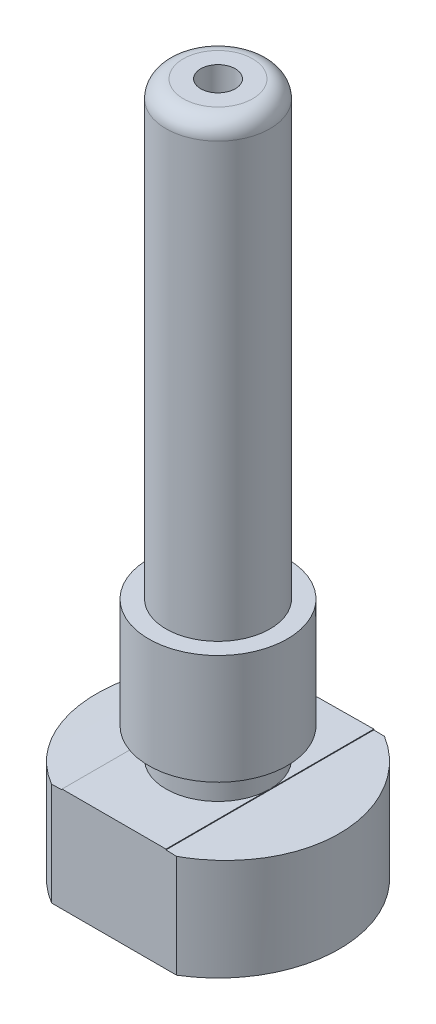
ISO-10303-21;
HEADER;
FILE_DESCRIPTION(('STEP AP214'),'2;1');
FILE_NAME('part.step','',(''),(''),'','','');
FILE_SCHEMA(('AUTOMOTIVE_DESIGN { 1 0 10303 214 1 1 1 1 }'));
ENDSEC;
DATA;
#1=APPLICATION_CONTEXT('core data for automotive mechanical design processes');
#2=APPLICATION_PROTOCOL_DEFINITION('international standard','automotive_design',2000,#1);
#3=PRODUCT_CONTEXT('',#1,'mechanical');
#4=PRODUCT('Part','Part','',(#3));
#5=PRODUCT_RELATED_PRODUCT_CATEGORY('part','',(#4));
#6=PRODUCT_DEFINITION_FORMATION('','',#4);
#7=PRODUCT_DEFINITION_CONTEXT('part definition',#1,'design');
#8=PRODUCT_DEFINITION('design','',#6,#7);
#9=PRODUCT_DEFINITION_SHAPE('','',#8);
#10=(LENGTH_UNIT() NAMED_UNIT(*) SI_UNIT(.MILLI.,.METRE.));
#11=(NAMED_UNIT(*) PLANE_ANGLE_UNIT() SI_UNIT($,.RADIAN.));
#12=(NAMED_UNIT(*) SI_UNIT($,.STERADIAN.) SOLID_ANGLE_UNIT());
#13=UNCERTAINTY_MEASURE_WITH_UNIT(LENGTH_MEASURE(1.E-05),#10,'distance_accuracy_value','');
#14=(GEOMETRIC_REPRESENTATION_CONTEXT(3) GLOBAL_UNCERTAINTY_ASSIGNED_CONTEXT((#13)) GLOBAL_UNIT_ASSIGNED_CONTEXT((#10,
#11,#12)) REPRESENTATION_CONTEXT('',''));
#15=CARTESIAN_POINT('',(0.,0.,0.));
#16=DIRECTION('',(0.,0.,1.));
#17=DIRECTION('',(1.,0.,0.));
#18=AXIS2_PLACEMENT_3D('',#15,#16,#17);
#19=CARTESIAN_POINT('',(-4.2001286876478,2.28951769879058,-0.000518058652977616));
#20=DIRECTION('',(0.,-1.,0.));
#21=DIRECTION('',(0.,0.,-1.));
#22=AXIS2_PLACEMENT_3D('',#19,#20,#21);
#23=PLANE('',#22);
#24=DIRECTION('',(1.,0.,0.));
#25=VECTOR('',#24,1.);
#26=CARTESIAN_POINT('',(-4.2001286876478,2.28951769879058,3.59948194134702));
#27=LINE('',#26,#25);
#28=CARTESIAN_POINT('',(-1.8001286876478,2.28951769879058,3.59948194134702));
#29=VERTEX_POINT('',#28);
#30=CARTESIAN_POINT('',(1.7998713123522,2.28951769879058,3.59948194134702));
#31=VERTEX_POINT('',#30);
#32=EDGE_CURVE('E254',#29,#31,#27,.T.);
#33=ORIENTED_EDGE('',*,*,#32,.T.);
#34=DIRECTION('',(0.,0.,-1.));
#35=VECTOR('',#34,1.);
#36=CARTESIAN_POINT('',(1.7998713123522,2.28951769879058,-0.000518058652977616));
#37=LINE('',#36,#35);
#38=CARTESIAN_POINT('',(1.7998713123522,2.28951769879058,-0.000518058652977616));
#39=VERTEX_POINT('',#38);
#40=EDGE_CURVE('E114',#31,#39,#37,.T.);
#41=ORIENTED_EDGE('',*,*,#40,.T.);
#42=CARTESIAN_POINT('',(-0.000128687647803785,2.28951769879058,-0.000518058652977616));
#43=DIRECTION('',(0.,-1.,0.));
#44=DIRECTION('',(0.,0.,-1.));
#45=AXIS2_PLACEMENT_3D('',#42,#43,#44);
#46=CIRCLE('',#45,1.8);
#47=CARTESIAN_POINT('',(-1.8001286876478,2.28951769879058,-0.000518058652977616));
#48=VERTEX_POINT('',#47);
#49=EDGE_CURVE('E217',#39,#48,#46,.T.);
#50=ORIENTED_EDGE('',*,*,#49,.T.);
#51=DIRECTION('',(0.,0.,1.));
#52=VECTOR('',#51,1.);
#53=CARTESIAN_POINT('',(-1.8001286876478,2.28951769879058,-0.000518058652977616));
#54=LINE('',#53,#52);
#55=EDGE_CURVE('E147',#48,#29,#54,.T.);
#56=ORIENTED_EDGE('',*,*,#55,.T.);
#57=EDGE_LOOP('',(#33,#41,#50,#56));
#58=FACE_BOUND('',#57,.T.);
#59=ADVANCED_FACE('F40',(#58),#23,.F.);
#60=CARTESIAN_POINT('',(-0.000128687647803785,7.08951769879058,-0.000518058652977616));
#61=DIRECTION('',(0.,-1.,0.));
#62=DIRECTION('',(0.,0.,-1.));
#63=AXIS2_PLACEMENT_3D('',#60,#61,#62);
#64=CYLINDRICAL_SURFACE('',#63,4.2);
#65=DIRECTION('',(0.,1.,0.));
#66=VECTOR('',#65,1.);
#67=CARTESIAN_POINT('',(-2.1634594529262,-1.31048230120942,3.59948194134702));
#68=LINE('',#67,#66);
#69=CARTESIAN_POINT('',(-2.1634594529262,-1.31048230120942,3.59948194134702));
#70=VERTEX_POINT('',#69);
#71=CARTESIAN_POINT('',(-2.1634594529262,2.25319461245755,3.59948194134702));
#72=VERTEX_POINT('',#71);
#73=EDGE_CURVE('E301',#70,#72,#68,.T.);
#74=ORIENTED_EDGE('',*,*,#73,.T.);
#75=CARTESIAN_POINT('',(-0.000128687647803785,2.28951769879058,-4.20051805865298));
#76=CARTESIAN_POINT('',(0.235518781097087,2.28951588214502,-4.20050769815472));
#77=CARTESIAN_POINT('',(0.471330734095594,2.28821128871708,-4.18061936312678));
#78=CARTESIAN_POINT('',(0.936441858705099,2.28313242983803,-4.10156714653202));
#79=CARTESIAN_POINT('',(1.16573315034603,2.27935529858545,-4.04235768855749));
#80=CARTESIAN_POINT('',(1.61099857126623,2.26975860716517,-3.88637239335896));
#81=CARTESIAN_POINT('',(1.82697971236756,2.26394013338431,-3.78961653514131));
#82=CARTESIAN_POINT('',(2.23957944413075,2.25091495754787,-3.56131776479715));
#83=CARTESIAN_POINT('',(2.43620242218838,2.24370857115287,-3.42978276015054));
#84=CARTESIAN_POINT('',(2.80487813359192,2.22870442030436,-3.13542709009451));
#85=CARTESIAN_POINT('',(2.97689542241088,2.22090582702874,-2.97256206954454));
#86=CARTESIAN_POINT('',(3.29117354861817,2.20560326939781,-2.62026131268546));
#87=CARTESIAN_POINT('',(3.43343313564982,2.19809931743349,-2.43082446044174));
#88=CARTESIAN_POINT('',(3.68426859877218,2.18422581984683,-2.03055448595496));
#89=CARTESIAN_POINT('',(3.79281475419303,2.1778572772593,-1.8197027010364));
#90=CARTESIAN_POINT('',(3.97295201078012,2.1669836062296,-1.38271890583423));
#91=CARTESIAN_POINT('',(4.04454353792581,2.16247845630804,-1.15658707171917));
#92=CARTESIAN_POINT('',(4.14864021432489,2.15584757223383,-0.69580600859938));
#93=CARTESIAN_POINT('',(4.18120126300346,2.15371843545933,-0.461169457786665));
#94=CARTESIAN_POINT('',(4.20648527045498,2.1520694951034,0.0102478176821255));
#95=CARTESIAN_POINT('',(4.19920871370767,2.15254965978929,0.247028516227473));
#96=CARTESIAN_POINT('',(4.14507042735841,2.1560620156916,0.715631612030463));
#97=CARTESIAN_POINT('',(4.09826921733263,2.15909030523034,0.947461034498664));
#98=CARTESIAN_POINT('',(3.96650402701632,2.16735150787241,1.39996641065667));
#99=CARTESIAN_POINT('',(3.88153980175271,2.17258443512758,1.62064229274041));
#100=CARTESIAN_POINT('',(3.67579180569732,2.1846696998997,2.04477066247269));
#101=CARTESIAN_POINT('',(3.55498061541464,2.19152327623998,2.24820981198239));
#102=CARTESIAN_POINT('',(3.28098793289167,2.20607627484098,2.63194399956192));
#103=CARTESIAN_POINT('',(3.12780604385537,2.21377570746955,2.81223875388705));
#104=CARTESIAN_POINT('',(2.79307953908114,2.22917009334079,3.14491833297421));
#105=CARTESIAN_POINT('',(2.61148255362282,2.23686501144183,3.29725047240387));
#106=CARTESIAN_POINT('',(2.22526421942711,2.2513694320824,3.56927417586689));
#107=CARTESIAN_POINT('',(2.02064286197007,2.2581789342866,3.68896572753875));
#108=CARTESIAN_POINT('',(1.59415202192499,2.27014582389567,3.89230632374027));
#109=CARTESIAN_POINT('',(1.37228156704669,2.27530311808551,3.97595333478432));
#110=CARTESIAN_POINT('',(0.917605057050025,2.28338321984848,4.10479503291603));
#111=CARTESIAN_POINT('',(0.684799140835611,2.28630605579591,4.14999020828567));
#112=CARTESIAN_POINT('',(0.215317279996358,2.28958423536001,4.20057993986636));
#113=CARTESIAN_POINT('',(-0.0213507848881777,2.28994427741364,4.20604733044635));
#114=CARTESIAN_POINT('',(-0.492240599859216,2.28806880153722,4.17721665391067));
#115=CARTESIAN_POINT('',(-0.726462363799166,2.28583329831383,4.14291881210956));
#116=CARTESIAN_POINT('',(-1.18560541758205,2.27902138799881,4.03559157455498));
#117=CARTESIAN_POINT('',(-1.41053456026761,2.27444700302901,3.96259563392611));
#118=CARTESIAN_POINT('',(-1.84494993356309,2.26347187473467,3.77997828587474));
#119=CARTESIAN_POINT('',(-2.05443601322192,2.25707111356086,3.67035652050424));
#120=CARTESIAN_POINT('',(-2.45235201925103,2.24315054289222,3.41741414137037));
#121=CARTESIAN_POINT('',(-2.64075099496916,2.23562912531262,3.274044927446));
#122=CARTESIAN_POINT('',(-2.99083316763771,2.22031893582661,2.95774805723168));
#123=CARTESIAN_POINT('',(-3.15251607909638,2.21253016106426,2.7848200851127));
#124=CARTESIAN_POINT('',(-3.44482361290868,2.19754946020587,2.41400004848851));
#125=CARTESIAN_POINT('',(-3.57540095211202,2.19035845343459,2.21607066972804));
#126=CARTESIAN_POINT('',(-3.80146721244084,2.17739891389247,1.80105364577936));
#127=CARTESIAN_POINT('',(-3.89695636526076,2.1716303717289,1.58396612710798));
#128=CARTESIAN_POINT('',(-4.05005393810421,2.16217294587405,1.13696725127721));
#129=CARTESIAN_POINT('',(-4.10769202605878,2.15848243373251,0.907066091255779));
#130=CARTESIAN_POINT('',(-4.1835481962071,2.15359275190498,0.440824561606566));
#131=CARTESIAN_POINT('',(-4.20176671051342,2.15239355490951,0.204484262592602));
#132=CARTESIAN_POINT('',(-4.19826233396074,2.15262240312011,-0.267456602457012));
#133=CARTESIAN_POINT('',(-4.17661377281209,2.1540455591132,-0.503057726395792));
#134=CARTESIAN_POINT('',(-4.09414397573341,2.15934838234714,-0.967271954523245));
#135=CARTESIAN_POINT('',(-4.03332266986973,2.16322805397353,-1.19588504623568));
#136=CARTESIAN_POINT('',(-3.87425087676172,2.1730055055994,-1.63964414153457));
#137=CARTESIAN_POINT('',(-3.77600082371683,2.17890326218762,-1.85479030131307));
#138=CARTESIAN_POINT('',(-3.5448704005183,2.19205219944129,-2.26554343509443));
#139=CARTESIAN_POINT('',(-3.41199088733055,2.19930334661348,-2.46115089245061));
#140=CARTESIAN_POINT('',(-3.1150977757255,2.21435776689595,-2.82765162656437));
#141=CARTESIAN_POINT('',(-2.95103020509709,2.22216198220804,-2.99850114182067));
#142=CARTESIAN_POINT('',(-2.59649524830234,2.23743498931848,-3.31029344175398));
#143=CARTESIAN_POINT('',(-2.40602142114045,2.24490369869018,-3.45122890852436));
#144=CARTESIAN_POINT('',(-2.00384734785504,2.258672485907,-3.69930561866506));
#145=CARTESIAN_POINT('',(-1.7921197050838,2.26497102479055,-3.80640248668576));
#146=CARTESIAN_POINT('',(-1.35379998066146,2.27566948971534,-3.9833953323237));
#147=CARTESIAN_POINT('',(-1.12722562166704,2.28007163359255,-4.05333478803696));
#148=CARTESIAN_POINT('',(-0.749413545842065,2.28533032709157,-4.13589067222189));
#149=CARTESIAN_POINT('',(-0.60061667769122,2.28689359387064,-4.16009450639801));
#150=CARTESIAN_POINT('',(-0.301278496788974,2.28898785947028,-4.19241149824406));
#151=CARTESIAN_POINT('',(-0.150737186683866,2.28951885985657,-4.20052468032008));
#152=CARTESIAN_POINT('',(-0.000128687647803785,2.28951769879058,-4.20051805865298));
#153=B_SPLINE_CURVE_WITH_KNOTS('',3,(#75,#76,#77,#78,#79,#80,#81,#82,#83,#84,#85,#86,#87,#88,
#89,#90,#91,#92,#93,#94,#95,#96,#97,#98,#99,#100,#101,#102,#103,#104,#105,#106,#107,#108,#109,
#110,#111,#112,#113,#114,#115,#116,#117,#118,#119,#120,#121,#122,#123,#124,#125,#126,#127,#128,
#129,#130,#131,#132,#133,#134,#135,#136,#137,#138,#139,#140,#141,#142,#143,#144,#145,#146,#147,
#148,#149,#150,#151,#152),.UNSPECIFIED.,.T.,.F.,(4,2,2,2,2,2,2,2,2,2,2,2,2,2,2,2,2,2,2,2,2,2,2,
2,2,2,2,2,2,2,2,2,2,2,2,2,2,2,4),(0.,0.706392587501985,1.41360537433638,2.12044235745799,
2.82711877021454,3.53480311527376,4.24251718978587,4.95085340278903,5.65918145055203,
6.36649381461139,7.07379757680463,7.7800202852152,8.4862475270209,9.19301636365285,
9.89979386427214,10.6078896584395,11.3159857207734,12.0241217257639,12.7322487383304,
13.4390771879944,14.1459016327032,14.8521160104827,15.5583372903707,16.2655818995258,
16.9728340659112,17.681154552549,18.3894703619186,19.0972303236236,19.8049825269106,
20.5114165054815,21.2178517452263,21.9242787900815,22.6306883548373,23.3383317064765,
24.0461479706768,24.7548886368938,25.4627981649617,25.9142729432388,26.3657470367248),.UNSPECIFIED.);
#154=CARTESIAN_POINT('',(-2.23423980420749,2.25077814855866,-3.55702582876461));
#155=VERTEX_POINT('',#154);
#156=EDGE_CURVE('E150',#72,#155,#153,.T.);
#157=ORIENTED_EDGE('',*,*,#156,.T.);
#158=DIRECTION('',(0.,1.,0.));
#159=VECTOR('',#158,1.);
#160=CARTESIAN_POINT('',(-2.23423980420749,-1.31048230120942,-3.55702582876461));
#161=LINE('',#160,#159);
#162=CARTESIAN_POINT('',(-2.23423980420749,-1.31048230120942,-3.55702582876461));
#163=VERTEX_POINT('',#162);
#164=EDGE_CURVE('E310',#163,#155,#161,.T.);
#165=ORIENTED_EDGE('',*,*,#164,.F.);
#166=CARTESIAN_POINT('',(-0.000128687647803785,-1.31048230120942,-0.000518058652977616));
#167=DIRECTION('',(0.,-1.,0.));
#168=DIRECTION('',(0.,0.,-1.));
#169=AXIS2_PLACEMENT_3D('',#166,#167,#168);
#170=CIRCLE('',#169,4.2);
#171=EDGE_CURVE('E222',#70,#163,#170,.T.);
#172=ORIENTED_EDGE('',*,*,#171,.F.);
#173=EDGE_LOOP('',(#74,#157,#165,#172));
#174=FACE_BOUND('',#173,.T.);
#175=ADVANCED_FACE('F195',(#174),#64,.T.);
#176=CARTESIAN_POINT('',(-1.2001286876478,22.6895176987906,-0.000518058652977616));
#177=DIRECTION('',(0.,-1.,0.));
#178=DIRECTION('',(0.,0.,-1.));
#179=AXIS2_PLACEMENT_3D('',#176,#177,#178);
#180=PLANE('',#179);
#181=CARTESIAN_POINT('',(-0.000128687647803785,22.6895176987906,-0.000518058652977616));
#182=DIRECTION('',(0.,1.,0.));
#183=DIRECTION('',(0.,0.,1.));
#184=AXIS2_PLACEMENT_3D('',#181,#182,#183);
#185=CIRCLE('',#184,0.6);
#186=CARTESIAN_POINT('',(-0.000128687647803785,22.6895176987906,0.599481941347022));
#187=VERTEX_POINT('',#186);
#188=EDGE_CURVE('E244',#187,#187,#185,.T.);
#189=ORIENTED_EDGE('',*,*,#188,.F.);
#190=EDGE_LOOP('',(#189));
#191=FACE_BOUND('',#190,.T.);
#192=CARTESIAN_POINT('',(-0.000128687647803785,22.6895176987906,-0.000518058652977616));
#193=DIRECTION('',(0.,-1.,0.));
#194=DIRECTION('',(0.,0.,-1.));
#195=AXIS2_PLACEMENT_3D('',#192,#193,#194);
#196=CIRCLE('',#195,1.2);
#197=CARTESIAN_POINT('',(-0.000128687647803785,22.6895176987906,-1.20051805865297));
#198=VERTEX_POINT('',#197);
#199=EDGE_CURVE('E237',#198,#198,#196,.T.);
#200=ORIENTED_EDGE('',*,*,#199,.F.);
#201=EDGE_LOOP('',(#200));
#202=FACE_BOUND('',#201,.T.);
#203=ADVANCED_FACE('F42',(#191,#202),#180,.F.);
#204=CARTESIAN_POINT('',(-0.000128687647803785,22.0895176987906,-0.000518058652977616));
#205=DIRECTION('',(0.,-1.,0.));
#206=DIRECTION('',(0.,0.,-1.));
#207=AXIS2_PLACEMENT_3D('',#204,#205,#206);
#208=TOROIDAL_SURFACE('',#207,1.2,0.6);
#209=CARTESIAN_POINT('',(-0.000128687647803785,22.0895176987906,-0.000518058652977616));
#210=DIRECTION('',(0.,-1.,0.));
#211=DIRECTION('',(0.,0.,-1.));
#212=AXIS2_PLACEMENT_3D('',#209,#210,#211);
#213=CIRCLE('',#212,1.8);
#214=CARTESIAN_POINT('',(-0.000128687647803785,22.0895176987906,-1.80051805865298));
#215=VERTEX_POINT('',#214);
#216=EDGE_CURVE('E234',#215,#215,#213,.T.);
#217=ORIENTED_EDGE('',*,*,#216,.F.);
#218=EDGE_LOOP('',(#217));
#219=FACE_BOUND('',#218,.T.);
#220=ORIENTED_EDGE('',*,*,#199,.T.);
#221=EDGE_LOOP('',(#220));
#222=FACE_BOUND('',#221,.T.);
#223=ADVANCED_FACE('F278',(#219,#222),#208,.T.);
#224=CARTESIAN_POINT('',(-0.000128687647803785,7.08951769879058,-0.000518058652977616));
#225=DIRECTION('',(0.,-1.,0.));
#226=DIRECTION('',(0.,0.,-1.));
#227=AXIS2_PLACEMENT_3D('',#224,#225,#226);
#228=CYLINDRICAL_SURFACE('',#227,1.8);
#229=CARTESIAN_POINT('',(-0.000128687647803785,7.08951769879058,-0.000518058652977616));
#230=DIRECTION('',(0.,-1.,0.));
#231=DIRECTION('',(0.,0.,-1.));
#232=AXIS2_PLACEMENT_3D('',#229,#230,#231);
#233=CIRCLE('',#232,1.8);
#234=CARTESIAN_POINT('',(-0.000128687647803785,7.08951769879058,-1.80051805865298));
#235=VERTEX_POINT('',#234);
#236=EDGE_CURVE('E231',#235,#235,#233,.T.);
#237=ORIENTED_EDGE('',*,*,#236,.F.);
#238=EDGE_LOOP('',(#237));
#239=FACE_BOUND('',#238,.T.);
#240=ORIENTED_EDGE('',*,*,#216,.T.);
#241=EDGE_LOOP('',(#240));
#242=FACE_BOUND('',#241,.T.);
#243=ADVANCED_FACE('F272',(#239,#242),#228,.T.);
#244=CARTESIAN_POINT('',(-1.8001286876478,7.08951769879058,-0.000518058652977616));
#245=DIRECTION('',(0.,-1.,0.));
#246=DIRECTION('',(0.,0.,-1.));
#247=AXIS2_PLACEMENT_3D('',#244,#245,#246);
#248=PLANE('',#247);
#249=CARTESIAN_POINT('',(-0.000128687647803785,7.08951769879058,-0.000518058652977616));
#250=DIRECTION('',(0.,-1.,0.));
#251=DIRECTION('',(0.,0.,-1.));
#252=AXIS2_PLACEMENT_3D('',#249,#250,#251);
#253=CIRCLE('',#252,2.4);
#254=CARTESIAN_POINT('',(-0.000128687647803785,7.08951769879058,-2.40051805865298));
#255=VERTEX_POINT('',#254);
#256=EDGE_CURVE('E228',#255,#255,#253,.T.);
#257=ORIENTED_EDGE('',*,*,#256,.F.);
#258=EDGE_LOOP('',(#257));
#259=FACE_BOUND('',#258,.T.);
#260=ORIENTED_EDGE('',*,*,#236,.T.);
#261=EDGE_LOOP('',(#260));
#262=FACE_BOUND('',#261,.T.);
#263=ADVANCED_FACE('F266',(#259,#262),#248,.F.);
#264=CARTESIAN_POINT('',(-0.000128687647803785,7.08951769879058,-0.000518058652977616));
#265=DIRECTION('',(0.,-1.,0.));
#266=DIRECTION('',(0.,0.,-1.));
#267=AXIS2_PLACEMENT_3D('',#264,#265,#266);
#268=CYLINDRICAL_SURFACE('',#267,2.4);
#269=CARTESIAN_POINT('',(-0.000128687647803785,3.28936859568007,-0.000518058652977616));
#270=DIRECTION('',(0.,-1.,0.));
#271=DIRECTION('',(0.,0.,-1.));
#272=AXIS2_PLACEMENT_3D('',#269,#270,#271);
#273=CIRCLE('',#272,2.4);
#274=CARTESIAN_POINT('',(-0.000128687647803785,3.28936859568007,-2.40051805865298));
#275=VERTEX_POINT('',#274);
#276=EDGE_CURVE('E220',#275,#275,#273,.T.);
#277=ORIENTED_EDGE('',*,*,#276,.F.);
#278=EDGE_LOOP('',(#277));
#279=FACE_BOUND('',#278,.T.);
#280=ORIENTED_EDGE('',*,*,#256,.T.);
#281=EDGE_LOOP('',(#280));
#282=FACE_BOUND('',#281,.T.);
#283=ADVANCED_FACE('F260',(#279,#282),#268,.T.);
#284=CARTESIAN_POINT('',(-1.8001286876478,3.28936859568007,-0.000518058652977616));
#285=DIRECTION('',(0.,1.,0.));
#286=DIRECTION('',(0.,0.,1.));
#287=AXIS2_PLACEMENT_3D('',#284,#285,#286);
#288=PLANE('',#287);
#289=CARTESIAN_POINT('',(-0.000128687647803785,3.28936859568007,-0.000518058652977616));
#290=DIRECTION('',(0.,-1.,0.));
#291=DIRECTION('',(0.,0.,-1.));
#292=AXIS2_PLACEMENT_3D('',#289,#290,#291);
#293=CIRCLE('',#292,1.8);
#294=CARTESIAN_POINT('',(-0.000128687647803785,3.28936859568007,-1.80051805865298));
#295=VERTEX_POINT('',#294);
#296=EDGE_CURVE('E216',#295,#295,#293,.T.);
#297=ORIENTED_EDGE('',*,*,#296,.F.);
#298=EDGE_LOOP('',(#297));
#299=FACE_BOUND('',#298,.T.);
#300=ORIENTED_EDGE('',*,*,#276,.T.);
#301=EDGE_LOOP('',(#300));
#302=FACE_BOUND('',#301,.T.);
#303=ADVANCED_FACE('F210',(#299,#302),#288,.F.);
#304=CARTESIAN_POINT('',(-0.000128687647803785,7.08951769879058,-0.000518058652977616));
#305=DIRECTION('',(0.,-1.,0.));
#306=DIRECTION('',(0.,0.,-1.));
#307=AXIS2_PLACEMENT_3D('',#304,#305,#306);
#308=CYLINDRICAL_SURFACE('',#307,1.8);
#309=ORIENTED_EDGE('',*,*,#49,.F.);
#310=EDGE_CURVE('E214',#48,#39,#46,.T.);
#311=ORIENTED_EDGE('',*,*,#310,.F.);
#312=EDGE_LOOP('',(#309,#311));
#313=FACE_BOUND('',#312,.T.);
#314=ORIENTED_EDGE('',*,*,#296,.T.);
#315=EDGE_LOOP('',(#314));
#316=FACE_BOUND('',#315,.T.);
#317=ADVANCED_FACE('F206',(#313,#316),#308,.T.);
#318=ORIENTED_EDGE('',*,*,#310,.T.);
#319=CARTESIAN_POINT('',(1.7998713123522,2.28951769879058,-3.59692459099755));
#320=VERTEX_POINT('',#319);
#321=EDGE_CURVE('E126',#39,#320,#37,.T.);
#322=ORIENTED_EDGE('',*,*,#321,.T.);
#323=DIRECTION('',(-0.999951094097558,0.,0.00988986415971316));
#324=VECTOR('',#323,1.);
#325=CARTESIAN_POINT('',(-4.23510806375344,2.28951769879058,-3.53723654566347));
#326=LINE('',#325,#324);
#327=CARTESIAN_POINT('',(-1.8001286876478,2.28951769879058,-3.56131933871559));
#328=VERTEX_POINT('',#327);
#329=EDGE_CURVE('E63',#320,#328,#326,.T.);
#330=ORIENTED_EDGE('',*,*,#329,.T.);
#331=EDGE_CURVE('E136',#328,#48,#54,.T.);
#332=ORIENTED_EDGE('',*,*,#331,.T.);
#333=EDGE_LOOP('',(#318,#322,#330,#332));
#334=FACE_BOUND('',#333,.T.);
#335=ADVANCED_FACE('F193',(#334),#23,.F.);
#336=DIRECTION('',(0.,1.,0.));
#337=VECTOR('',#336,1.);
#338=CARTESIAN_POINT('',(2.16320207763059,-1.31048230120942,-3.60051805865298));
#339=LINE('',#338,#337);
#340=CARTESIAN_POINT('',(2.16320207763059,-1.31048230120942,-3.60051805865298));
#341=VERTEX_POINT('',#340);
#342=CARTESIAN_POINT('',(2.16320207763059,2.25319461245753,-3.60051805865298));
#343=VERTEX_POINT('',#342);
#344=EDGE_CURVE('E309',#341,#343,#339,.T.);
#345=ORIENTED_EDGE('',*,*,#344,.T.);
#346=CARTESIAN_POINT('',(-0.000128687647803785,2.28951769879058,-4.20051805865298));
#347=CARTESIAN_POINT('',(0.235518781097087,2.28951588214502,-4.20050769815472));
#348=CARTESIAN_POINT('',(0.471330734095594,2.28821128871708,-4.18061936312678));
#349=CARTESIAN_POINT('',(0.936441858705099,2.28313242983803,-4.10156714653202));
#350=CARTESIAN_POINT('',(1.16573315034603,2.27935529858545,-4.04235768855749));
#351=CARTESIAN_POINT('',(1.61099857126623,2.26975860716517,-3.88637239335896));
#352=CARTESIAN_POINT('',(1.82697971236756,2.26394013338431,-3.78961653514131));
#353=CARTESIAN_POINT('',(2.23957944413075,2.25091495754787,-3.56131776479715));
#354=CARTESIAN_POINT('',(2.43620242218838,2.24370857115287,-3.42978276015054));
#355=CARTESIAN_POINT('',(2.80487813359192,2.22870442030436,-3.13542709009451));
#356=CARTESIAN_POINT('',(2.97689542241088,2.22090582702874,-2.97256206954454));
#357=CARTESIAN_POINT('',(3.29117354861817,2.20560326939781,-2.62026131268546));
#358=CARTESIAN_POINT('',(3.43343313564982,2.19809931743349,-2.43082446044174));
#359=CARTESIAN_POINT('',(3.68426859877218,2.18422581984683,-2.03055448595496));
#360=CARTESIAN_POINT('',(3.79281475419303,2.1778572772593,-1.8197027010364));
#361=CARTESIAN_POINT('',(3.97295201078012,2.1669836062296,-1.38271890583423));
#362=CARTESIAN_POINT('',(4.04454353792581,2.16247845630804,-1.15658707171917));
#363=CARTESIAN_POINT('',(4.14864021432489,2.15584757223383,-0.69580600859938));
#364=CARTESIAN_POINT('',(4.18120126300346,2.15371843545933,-0.461169457786665));
#365=CARTESIAN_POINT('',(4.20648527045498,2.1520694951034,0.0102478176821255));
#366=CARTESIAN_POINT('',(4.19920871370767,2.15254965978929,0.247028516227473));
#367=CARTESIAN_POINT('',(4.14507042735841,2.1560620156916,0.715631612030463));
#368=CARTESIAN_POINT('',(4.09826921733263,2.15909030523034,0.947461034498664));
#369=CARTESIAN_POINT('',(3.96650402701632,2.16735150787241,1.39996641065667));
#370=CARTESIAN_POINT('',(3.88153980175271,2.17258443512758,1.62064229274041));
#371=CARTESIAN_POINT('',(3.67579180569732,2.1846696998997,2.04477066247269));
#372=CARTESIAN_POINT('',(3.55498061541464,2.19152327623998,2.24820981198239));
#373=CARTESIAN_POINT('',(3.28098793289167,2.20607627484098,2.63194399956192));
#374=CARTESIAN_POINT('',(3.12780604385537,2.21377570746955,2.81223875388705));
#375=CARTESIAN_POINT('',(2.79307953908114,2.22917009334079,3.14491833297421));
#376=CARTESIAN_POINT('',(2.61148255362282,2.23686501144183,3.29725047240387));
#377=CARTESIAN_POINT('',(2.22526421942711,2.2513694320824,3.56927417586689));
#378=CARTESIAN_POINT('',(2.02064286197007,2.2581789342866,3.68896572753875));
#379=CARTESIAN_POINT('',(1.59415202192499,2.27014582389567,3.89230632374027));
#380=CARTESIAN_POINT('',(1.37228156704669,2.27530311808551,3.97595333478432));
#381=CARTESIAN_POINT('',(0.917605057050025,2.28338321984848,4.10479503291603));
#382=CARTESIAN_POINT('',(0.684799140835611,2.28630605579591,4.14999020828567));
#383=CARTESIAN_POINT('',(0.215317279996358,2.28958423536001,4.20057993986636));
#384=CARTESIAN_POINT('',(-0.0213507848881777,2.28994427741364,4.20604733044635));
#385=CARTESIAN_POINT('',(-0.492240599859216,2.28806880153722,4.17721665391067));
#386=CARTESIAN_POINT('',(-0.726462363799166,2.28583329831383,4.14291881210956));
#387=CARTESIAN_POINT('',(-1.18560541758205,2.27902138799881,4.03559157455498));
#388=CARTESIAN_POINT('',(-1.41053456026761,2.27444700302901,3.96259563392611));
#389=CARTESIAN_POINT('',(-1.84494993356309,2.26347187473467,3.77997828587474));
#390=CARTESIAN_POINT('',(-2.05443601322192,2.25707111356086,3.67035652050424));
#391=CARTESIAN_POINT('',(-2.45235201925103,2.24315054289222,3.41741414137037));
#392=CARTESIAN_POINT('',(-2.64075099496916,2.23562912531262,3.274044927446));
#393=CARTESIAN_POINT('',(-2.99083316763771,2.22031893582661,2.95774805723168));
#394=CARTESIAN_POINT('',(-3.15251607909638,2.21253016106426,2.7848200851127));
#395=CARTESIAN_POINT('',(-3.44482361290868,2.19754946020587,2.41400004848851));
#396=CARTESIAN_POINT('',(-3.57540095211202,2.19035845343459,2.21607066972804));
#397=CARTESIAN_POINT('',(-3.80146721244084,2.17739891389247,1.80105364577936));
#398=CARTESIAN_POINT('',(-3.89695636526076,2.1716303717289,1.58396612710798));
#399=CARTESIAN_POINT('',(-4.05005393810421,2.16217294587405,1.13696725127721));
#400=CARTESIAN_POINT('',(-4.10769202605878,2.15848243373251,0.907066091255779));
#401=CARTESIAN_POINT('',(-4.1835481962071,2.15359275190498,0.440824561606566));
#402=CARTESIAN_POINT('',(-4.20176671051342,2.15239355490951,0.204484262592602));
#403=CARTESIAN_POINT('',(-4.19826233396074,2.15262240312011,-0.267456602457012));
#404=CARTESIAN_POINT('',(-4.17661377281209,2.1540455591132,-0.503057726395792));
#405=CARTESIAN_POINT('',(-4.09414397573341,2.15934838234714,-0.967271954523245));
#406=CARTESIAN_POINT('',(-4.03332266986973,2.16322805397353,-1.19588504623568));
#407=CARTESIAN_POINT('',(-3.87425087676172,2.1730055055994,-1.63964414153457));
#408=CARTESIAN_POINT('',(-3.77600082371683,2.17890326218762,-1.85479030131307));
#409=CARTESIAN_POINT('',(-3.5448704005183,2.19205219944129,-2.26554343509443));
#410=CARTESIAN_POINT('',(-3.41199088733055,2.19930334661348,-2.46115089245061));
#411=CARTESIAN_POINT('',(-3.1150977757255,2.21435776689595,-2.82765162656437));
#412=CARTESIAN_POINT('',(-2.95103020509709,2.22216198220804,-2.99850114182067));
#413=CARTESIAN_POINT('',(-2.59649524830234,2.23743498931848,-3.31029344175398));
#414=CARTESIAN_POINT('',(-2.40602142114045,2.24490369869018,-3.45122890852436));
#415=CARTESIAN_POINT('',(-2.00384734785504,2.258672485907,-3.69930561866506));
#416=CARTESIAN_POINT('',(-1.7921197050838,2.26497102479055,-3.80640248668576));
#417=CARTESIAN_POINT('',(-1.35379998066146,2.27566948971534,-3.9833953323237));
#418=CARTESIAN_POINT('',(-1.12722562166704,2.28007163359255,-4.05333478803696));
#419=CARTESIAN_POINT('',(-0.749413545842065,2.28533032709157,-4.13589067222189));
#420=CARTESIAN_POINT('',(-0.60061667769122,2.28689359387064,-4.16009450639801));
#421=CARTESIAN_POINT('',(-0.301278496788974,2.28898785947028,-4.19241149824406));
#422=CARTESIAN_POINT('',(-0.150737186683866,2.28951885985657,-4.20052468032008));
#423=CARTESIAN_POINT('',(-0.000128687647803785,2.28951769879058,-4.20051805865298));
#424=B_SPLINE_CURVE_WITH_KNOTS('',3,(#346,#347,#348,#349,#350,#351,#352,#353,#354,#355,#356,
#357,#358,#359,#360,#361,#362,#363,#364,#365,#366,#367,#368,#369,#370,#371,#372,#373,#374,#375,
#376,#377,#378,#379,#380,#381,#382,#383,#384,#385,#386,#387,#388,#389,#390,#391,#392,#393,#394,
#395,#396,#397,#398,#399,#400,#401,#402,#403,#404,#405,#406,#407,#408,#409,#410,#411,#412,#413,
#414,#415,#416,#417,#418,#419,#420,#421,#422,#423),.UNSPECIFIED.,.T.,.F.,(4,2,2,2,2,2,2,2,2,2,2,
2,2,2,2,2,2,2,2,2,2,2,2,2,2,2,2,2,2,2,2,2,2,2,2,2,2,2,4),(0.,0.706392587501985,1.41360537433638,
2.12044235745799,2.82711877021454,3.53480311527376,4.24251718978587,4.95085340278903,
5.65918145055203,6.36649381461139,7.07379757680463,7.7800202852152,8.4862475270209,
9.19301636365285,9.89979386427214,10.6078896584395,11.3159857207734,12.0241217257639,
12.7322487383304,13.4390771879944,14.1459016327032,14.8521160104827,15.5583372903707,
16.2655818995258,16.9728340659112,17.681154552549,18.3894703619186,19.0972303236236,
19.8049825269106,20.5114165054815,21.2178517452263,21.9242787900815,22.6306883548373,
23.3383317064765,24.0461479706768,24.7548886368938,25.4627981649617,25.9142729432388,
26.3657470367248),.UNSPECIFIED.);
#425=CARTESIAN_POINT('',(2.16320207763059,2.25319461245755,3.59948194134702));
#426=VERTEX_POINT('',#425);
#427=EDGE_CURVE('E119',#343,#426,#424,.T.);
#428=ORIENTED_EDGE('',*,*,#427,.T.);
#429=DIRECTION('',(0.,1.,0.));
#430=VECTOR('',#429,1.);
#431=CARTESIAN_POINT('',(2.16320207763059,-1.31048230120942,3.59948194134702));
#432=LINE('',#431,#430);
#433=CARTESIAN_POINT('',(2.16320207763059,-1.31048230120942,3.59948194134702));
#434=VERTEX_POINT('',#433);
#435=EDGE_CURVE('E132',#434,#426,#432,.T.);
#436=ORIENTED_EDGE('',*,*,#435,.F.);
#437=EDGE_CURVE('E293',#341,#434,#170,.T.);
#438=ORIENTED_EDGE('',*,*,#437,.F.);
#439=EDGE_LOOP('',(#345,#428,#436,#438));
#440=FACE_BOUND('',#439,.T.);
#441=ADVANCED_FACE('F159',(#440),#64,.T.);
#442=CARTESIAN_POINT('',(-0.000128687647803785,-1.31048230120942,-0.000518058652977616));
#443=DIRECTION('',(0.,1.,0.));
#444=DIRECTION('',(0.,0.,1.));
#445=AXIS2_PLACEMENT_3D('',#442,#443,#444);
#446=PLANE('',#445);
#447=CARTESIAN_POINT('',(-0.000128687647803785,-1.31048230120942,-0.000518058652977616));
#448=DIRECTION('',(0.,-1.,0.));
#449=DIRECTION('',(0.,0.,-1.));
#450=AXIS2_PLACEMENT_3D('',#447,#448,#449);
#451=CIRCLE('',#450,1.19999999999999);
#452=CARTESIAN_POINT('',(-0.000128687647803785,-1.31048230120942,-1.20051805865296));
#453=VERTEX_POINT('',#452);
#454=EDGE_CURVE('E297',#453,#453,#451,.T.);
#455=ORIENTED_EDGE('',*,*,#454,.F.);
#456=EDGE_LOOP('',(#455));
#457=FACE_BOUND('',#456,.T.);
#458=ORIENTED_EDGE('',*,*,#171,.T.);
#459=DIRECTION('',(0.999951094097558,0.,-0.00988986415971316));
#460=VECTOR('',#459,1.);
#461=CARTESIAN_POINT('',(-2.23423980420749,-1.31048230120942,-3.55702582876461));
#462=LINE('',#461,#460);
#463=EDGE_CURVE('E313',#163,#341,#462,.T.);
#464=ORIENTED_EDGE('',*,*,#463,.T.);
#465=ORIENTED_EDGE('',*,*,#437,.T.);
#466=DIRECTION('',(-1.,0.,0.));
#467=VECTOR('',#466,1.);
#468=CARTESIAN_POINT('',(2.16320207763059,-1.31048230120942,3.59948194134702));
#469=LINE('',#468,#467);
#470=EDGE_CURVE('E303',#434,#70,#469,.T.);
#471=ORIENTED_EDGE('',*,*,#470,.T.);
#472=EDGE_LOOP('',(#458,#464,#465,#471));
#473=FACE_BOUND('',#472,.T.);
#474=ADVANCED_FACE('F186',(#457,#473),#446,.F.);
#475=CARTESIAN_POINT('',(-0.000128687647803785,-1.31048230120942,-0.000518058652977616));
#476=DIRECTION('',(0.,1.,0.));
#477=DIRECTION('',(0.,0.,1.));
#478=AXIS2_PLACEMENT_3D('',#475,#476,#477);
#479=CYLINDRICAL_SURFACE('',#478,0.6);
#480=CARTESIAN_POINT('',(-0.000128687647803785,1.45003407020711,-0.000518058652977616));
#481=DIRECTION('',(0.,-1.,0.));
#482=DIRECTION('',(0.,0.,-1.));
#483=AXIS2_PLACEMENT_3D('',#480,#481,#482);
#484=CIRCLE('',#483,0.6);
#485=CARTESIAN_POINT('',(-0.000128687647803785,1.45003407020711,-0.600518058652977));
#486=VERTEX_POINT('',#485);
#487=EDGE_CURVE('E241',#486,#486,#484,.T.);
#488=ORIENTED_EDGE('',*,*,#487,.T.);
#489=EDGE_LOOP('',(#488));
#490=FACE_BOUND('',#489,.T.);
#491=ORIENTED_EDGE('',*,*,#188,.T.);
#492=EDGE_LOOP('',(#491));
#493=FACE_BOUND('',#492,.T.);
#494=ADVANCED_FACE('F183',(#490,#493),#479,.F.);
#495=CARTESIAN_POINT('',(-0.000128687647803785,1.08951769879058,-0.000518058652977616));
#496=DIRECTION('',(0.,-1.,0.));
#497=DIRECTION('',(0.,0.,-1.));
#498=AXIS2_PLACEMENT_3D('',#495,#496,#497);
#499=CONICAL_SURFACE('',#498,1.2,1.02974425867665);
#500=CARTESIAN_POINT('',(-0.000128687647803785,1.08951769879058,-0.000518058652977616));
#501=DIRECTION('',(0.,-1.,0.));
#502=DIRECTION('',(0.,0.,-1.));
#503=AXIS2_PLACEMENT_3D('',#500,#501,#502);
#504=CIRCLE('',#503,1.2);
#505=CARTESIAN_POINT('',(-0.000128687647803785,1.08951769879058,-1.20051805865298));
#506=VERTEX_POINT('',#505);
#507=EDGE_CURVE('E245',#506,#506,#504,.T.);
#508=ORIENTED_EDGE('',*,*,#507,.T.);
#509=EDGE_LOOP('',(#508));
#510=FACE_BOUND('',#509,.T.);
#511=ORIENTED_EDGE('',*,*,#487,.F.);
#512=EDGE_LOOP('',(#511));
#513=FACE_BOUND('',#512,.T.);
#514=ADVANCED_FACE('F179',(#510,#513),#499,.F.);
#515=CARTESIAN_POINT('',(-0.000128687647803785,-1.31048230120942,-0.000518058652977616));
#516=DIRECTION('',(0.,-1.,0.));
#517=DIRECTION('',(0.,0.,-1.));
#518=AXIS2_PLACEMENT_3D('',#515,#516,#517);
#519=CYLINDRICAL_SURFACE('',#518,1.19999999999999);
#520=ORIENTED_EDGE('',*,*,#507,.F.);
#521=EDGE_LOOP('',(#520));
#522=FACE_BOUND('',#521,.T.);
#523=ORIENTED_EDGE('',*,*,#454,.T.);
#524=EDGE_LOOP('',(#523));
#525=FACE_BOUND('',#524,.T.);
#526=ADVANCED_FACE('F176',(#522,#525),#519,.F.);
#527=CARTESIAN_POINT('',(2.16320207763059,-1.31048230120942,3.59948194134702));
#528=DIRECTION('',(0.,0.,-1.));
#529=DIRECTION('',(-1.,0.,0.));
#530=AXIS2_PLACEMENT_3D('',#527,#528,#529);
#531=PLANE('',#530);
#532=ORIENTED_EDGE('',*,*,#435,.T.);
#533=CARTESIAN_POINT('',(-0.000128687647795893,-62.1504823012094,3.59948194134702));
#534=DIRECTION('',(0.,0.,-1.));
#535=DIRECTION('',(-1.,0.,0.));
#536=AXIS2_PLACEMENT_3D('',#533,#534,#535);
#537=CIRCLE('',#536,64.44);
#538=CARTESIAN_POINT('',(1.7998713123522,2.2643731282643,3.59948194134702));
#539=VERTEX_POINT('',#538);
#540=EDGE_CURVE('E123',#426,#539,#537,.F.);
#541=ORIENTED_EDGE('',*,*,#540,.T.);
#542=DIRECTION('',(0.,1.,0.));
#543=VECTOR('',#542,1.);
#544=CARTESIAN_POINT('',(1.7998713123522,-1.31048230120942,3.59948194134702));
#545=LINE('',#544,#543);
#546=EDGE_CURVE('E111',#539,#31,#545,.T.);
#547=ORIENTED_EDGE('',*,*,#546,.T.);
#548=ORIENTED_EDGE('',*,*,#32,.F.);
#549=DIRECTION('',(0.,-1.,0.));
#550=VECTOR('',#549,1.);
#551=CARTESIAN_POINT('',(-1.8001286876478,-1.31048230120942,3.59948194134702));
#552=LINE('',#551,#550);
#553=CARTESIAN_POINT('',(-1.8001286876478,2.2643731282643,3.59948194134702));
#554=VERTEX_POINT('',#553);
#555=EDGE_CURVE('E146',#29,#554,#552,.T.);
#556=ORIENTED_EDGE('',*,*,#555,.T.);
#557=CARTESIAN_POINT('',(-0.000128687647795893,-62.1504823012094,3.59948194134702));
#558=DIRECTION('',(0.,0.,-1.));
#559=DIRECTION('',(-1.,0.,0.));
#560=AXIS2_PLACEMENT_3D('',#557,#558,#559);
#561=CIRCLE('',#560,64.44);
#562=EDGE_CURVE('E157',#554,#72,#561,.F.);
#563=ORIENTED_EDGE('',*,*,#562,.T.);
#564=ORIENTED_EDGE('',*,*,#73,.F.);
#565=ORIENTED_EDGE('',*,*,#470,.F.);
#566=EDGE_LOOP('',(#532,#541,#547,#548,#556,#563,#564,#565));
#567=FACE_BOUND('',#566,.T.);
#568=ADVANCED_FACE('F129',(#567),#531,.F.);
#569=CARTESIAN_POINT('',(-2.23423980420749,-1.31048230120942,-3.55702582876461));
#570=DIRECTION('',(0.00988986415971316,0.,0.999951094097558));
#571=DIRECTION('',(0.999951094097558,0.,-0.00988986415971316));
#572=AXIS2_PLACEMENT_3D('',#569,#570,#571);
#573=PLANE('',#572);
#574=DIRECTION('',(0.,-1.,0.));
#575=VECTOR('',#574,1.);
#576=CARTESIAN_POINT('',(1.7998713123522,-1.31048230120942,-3.59692459099755));
#577=LINE('',#576,#575);
#578=CARTESIAN_POINT('',(1.7998713123522,2.2643731282643,-3.59692459099755));
#579=VERTEX_POINT('',#578);
#580=EDGE_CURVE('E48',#320,#579,#577,.T.);
#581=ORIENTED_EDGE('',*,*,#580,.T.);
#582=CARTESIAN_POINT('',(-0.000128687647795893,-62.1504823012094,-3.57912196485657));
#583=DIRECTION('',(0.00988986415971316,0.,0.999951094097558));
#584=DIRECTION('',(-0.999951094097558,0.,0.00988986415971316));
#585=AXIS2_PLACEMENT_3D('',#582,#583,#584);
#586=ELLIPSE('',#585,64.4431516504877,64.44);
#587=EDGE_CURVE('E11',#579,#343,#586,.F.);
#588=ORIENTED_EDGE('',*,*,#587,.T.);
#589=ORIENTED_EDGE('',*,*,#344,.F.);
#590=ORIENTED_EDGE('',*,*,#463,.F.);
#591=ORIENTED_EDGE('',*,*,#164,.T.);
#592=CARTESIAN_POINT('',(-0.000128687647795893,-62.1504823012094,-3.57912196485657));
#593=DIRECTION('',(0.00988986415971316,0.,0.999951094097558));
#594=DIRECTION('',(-0.999951094097558,0.,0.00988986415971316));
#595=AXIS2_PLACEMENT_3D('',#592,#593,#594);
#596=ELLIPSE('',#595,64.4431516504877,64.44);
#597=CARTESIAN_POINT('',(-1.8001286876478,2.2643731282643,-3.56131933871559));
#598=VERTEX_POINT('',#597);
#599=EDGE_CURVE('E248',#155,#598,#596,.F.);
#600=ORIENTED_EDGE('',*,*,#599,.T.);
#601=DIRECTION('',(0.,1.,0.));
#602=VECTOR('',#601,1.);
#603=CARTESIAN_POINT('',(-1.8001286876478,-1.31048230120942,-3.56131933871559));
#604=LINE('',#603,#602);
#605=EDGE_CURVE('E240',#598,#328,#604,.T.);
#606=ORIENTED_EDGE('',*,*,#605,.T.);
#607=ORIENTED_EDGE('',*,*,#329,.F.);
#608=EDGE_LOOP('',(#581,#588,#589,#590,#591,#600,#606,#607));
#609=FACE_BOUND('',#608,.T.);
#610=ADVANCED_FACE('F169',(#609),#573,.F.);
#611=CARTESIAN_POINT('',(-0.000128687647795893,-62.1504823012094,-21.600518058653));
#612=DIRECTION('',(0.,0.,1.));
#613=DIRECTION('',(1.,0.,0.));
#614=AXIS2_PLACEMENT_3D('',#611,#612,#613);
#615=CYLINDRICAL_SURFACE('',#614,64.44);
#616=DIRECTION('',(0.,0.,1.));
#617=VECTOR('',#616,1.);
#618=CARTESIAN_POINT('',(-1.8001286876478,2.2643731282643,-21.600518058653));
#619=LINE('',#618,#617);
#620=EDGE_CURVE('E133',#598,#554,#619,.T.);
#621=ORIENTED_EDGE('',*,*,#620,.F.);
#622=ORIENTED_EDGE('',*,*,#599,.F.);
#623=ORIENTED_EDGE('',*,*,#156,.F.);
#624=ORIENTED_EDGE('',*,*,#562,.F.);
#625=EDGE_LOOP('',(#621,#622,#623,#624));
#626=FACE_BOUND('',#625,.T.);
#627=ADVANCED_FACE('F163',(#626),#615,.T.);
#628=CARTESIAN_POINT('',(-1.8001286876478,2.57691600877805,-21.600518058653));
#629=DIRECTION('',(1.,0.,0.));
#630=DIRECTION('',(0.,0.,-1.));
#631=AXIS2_PLACEMENT_3D('',#628,#629,#630);
#632=PLANE('',#631);
#633=ORIENTED_EDGE('',*,*,#331,.F.);
#634=ORIENTED_EDGE('',*,*,#605,.F.);
#635=ORIENTED_EDGE('',*,*,#620,.T.);
#636=ORIENTED_EDGE('',*,*,#555,.F.);
#637=ORIENTED_EDGE('',*,*,#55,.F.);
#638=EDGE_LOOP('',(#633,#634,#635,#636,#637));
#639=FACE_BOUND('',#638,.T.);
#640=ADVANCED_FACE('F168',(#639),#632,.F.);
#641=CARTESIAN_POINT('',(-0.000128687647795893,-62.1504823012094,-21.600518058653));
#642=DIRECTION('',(0.,0.,1.));
#643=DIRECTION('',(1.,0.,0.));
#644=AXIS2_PLACEMENT_3D('',#641,#642,#643);
#645=CYLINDRICAL_SURFACE('',#644,64.44);
#646=ORIENTED_EDGE('',*,*,#427,.F.);
#647=ORIENTED_EDGE('',*,*,#587,.F.);
#648=DIRECTION('',(0.,0.,1.));
#649=VECTOR('',#648,1.);
#650=CARTESIAN_POINT('',(1.7998713123522,2.2643731282643,-21.600518058653));
#651=LINE('',#650,#649);
#652=EDGE_CURVE('E55',#579,#539,#651,.T.);
#653=ORIENTED_EDGE('',*,*,#652,.T.);
#654=ORIENTED_EDGE('',*,*,#540,.F.);
#655=EDGE_LOOP('',(#646,#647,#653,#654));
#656=FACE_BOUND('',#655,.T.);
#657=ADVANCED_FACE('F122',(#656),#645,.T.);
#658=CARTESIAN_POINT('',(1.7998713123522,2.57691600877804,-21.600518058653));
#659=DIRECTION('',(-1.,0.,0.));
#660=DIRECTION('',(0.,0.,1.));
#661=AXIS2_PLACEMENT_3D('',#658,#659,#660);
#662=PLANE('',#661);
#663=ORIENTED_EDGE('',*,*,#652,.F.);
#664=ORIENTED_EDGE('',*,*,#580,.F.);
#665=ORIENTED_EDGE('',*,*,#321,.F.);
#666=ORIENTED_EDGE('',*,*,#40,.F.);
#667=ORIENTED_EDGE('',*,*,#546,.F.);
#668=EDGE_LOOP('',(#663,#664,#665,#666,#667));
#669=FACE_BOUND('',#668,.T.);
#670=ADVANCED_FACE('F112',(#669),#662,.F.);
#671=CLOSED_SHELL('',(#59,#175,#203,#223,#243,#263,#283,#303,#317,#335,#441,#474,#494,#514,#526,
#568,#610,#627,#640,#657,#670));
#672=MANIFOLD_SOLID_BREP('B2',#671);
#673=ADVANCED_BREP_SHAPE_REPRESENTATION('',(#18,#672),#14);
#674=SHAPE_DEFINITION_REPRESENTATION(#9,#673);
ENDSEC;
END-ISO-10303-21;
